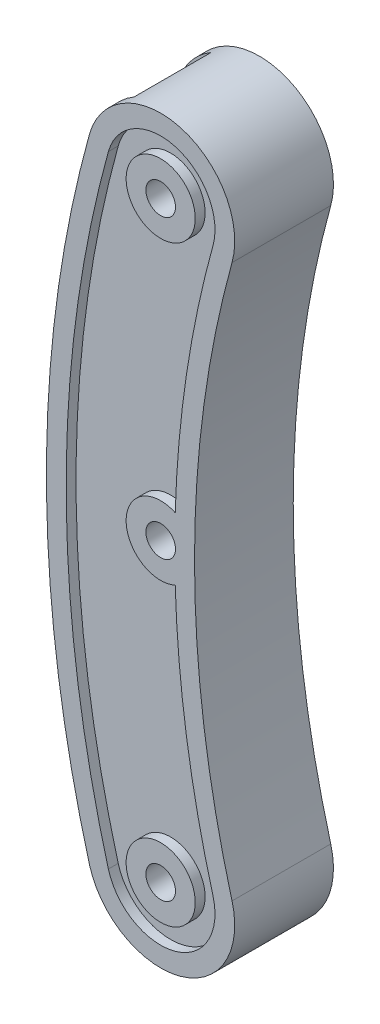
ISO-10303-21;
HEADER;
FILE_DESCRIPTION(('STEP AP214'),'2;1');
FILE_NAME('part.step','',(''),(''),'','','');
FILE_SCHEMA(('AUTOMOTIVE_DESIGN { 1 0 10303 214 1 1 1 1 }'));
ENDSEC;
DATA;
#1=APPLICATION_CONTEXT('core data for automotive mechanical design processes');
#2=APPLICATION_PROTOCOL_DEFINITION('international standard','automotive_design',2000,#1);
#3=PRODUCT_CONTEXT('',#1,'mechanical');
#4=PRODUCT('Part','Part','',(#3));
#5=PRODUCT_RELATED_PRODUCT_CATEGORY('part','',(#4));
#6=PRODUCT_DEFINITION_FORMATION('','',#4);
#7=PRODUCT_DEFINITION_CONTEXT('part definition',#1,'design');
#8=PRODUCT_DEFINITION('design','',#6,#7);
#9=PRODUCT_DEFINITION_SHAPE('','',#8);
#10=(LENGTH_UNIT() NAMED_UNIT(*) SI_UNIT(.MILLI.,.METRE.));
#11=(NAMED_UNIT(*) PLANE_ANGLE_UNIT() SI_UNIT($,.RADIAN.));
#12=(NAMED_UNIT(*) SI_UNIT($,.STERADIAN.) SOLID_ANGLE_UNIT());
#13=UNCERTAINTY_MEASURE_WITH_UNIT(LENGTH_MEASURE(1.E-05),#10,'distance_accuracy_value','');
#14=(GEOMETRIC_REPRESENTATION_CONTEXT(3) GLOBAL_UNCERTAINTY_ASSIGNED_CONTEXT((#13)) GLOBAL_UNIT_ASSIGNED_CONTEXT((#10,
#11,#12)) REPRESENTATION_CONTEXT('',''));
#15=CARTESIAN_POINT('',(0.,0.,0.));
#16=DIRECTION('',(0.,0.,1.));
#17=DIRECTION('',(1.,0.,0.));
#18=AXIS2_PLACEMENT_3D('',#15,#16,#17);
#19=CARTESIAN_POINT('',(0.,0.,5.));
#20=DIRECTION('',(0.,0.,-1.));
#21=DIRECTION('',(-1.,0.,0.));
#22=AXIS2_PLACEMENT_3D('',#19,#20,#21);
#23=CYLINDRICAL_SURFACE('',#22,120.);
#24=CARTESIAN_POINT('',(0.,0.,-3.9));
#25=DIRECTION('',(0.,0.,1.));
#26=DIRECTION('',(1.,0.,0.));
#27=AXIS2_PLACEMENT_3D('',#24,#25,#26);
#28=CIRCLE('',#27,120.);
#29=CARTESIAN_POINT('',(-115.654658358408,32.,-3.9));
#30=VERTEX_POINT('',#29);
#31=CARTESIAN_POINT('',(-115.654658358408,-32.,-3.9));
#32=VERTEX_POINT('',#31);
#33=EDGE_CURVE('E312',#30,#32,#28,.T.);
#34=ORIENTED_EDGE('',*,*,#33,.F.);
#35=DIRECTION('',(0.,0.,-1.));
#36=VECTOR('',#35,1.);
#37=CARTESIAN_POINT('',(-115.654658358408,32.,5.));
#38=LINE('',#37,#36);
#39=CARTESIAN_POINT('',(-115.654658358408,32.,-5.));
#40=VERTEX_POINT('',#39);
#41=EDGE_CURVE('E178',#30,#40,#38,.T.);
#42=ORIENTED_EDGE('',*,*,#41,.T.);
#43=CARTESIAN_POINT('',(0.,0.,-5.));
#44=DIRECTION('',(0.,0.,1.));
#45=DIRECTION('',(1.,0.,0.));
#46=AXIS2_PLACEMENT_3D('',#43,#44,#45);
#47=CIRCLE('',#46,120.);
#48=CARTESIAN_POINT('',(-115.654658358408,-32.,-5.));
#49=VERTEX_POINT('',#48);
#50=EDGE_CURVE('E192',#40,#49,#47,.T.);
#51=ORIENTED_EDGE('',*,*,#50,.T.);
#52=DIRECTION('',(0.,0.,-1.));
#53=VECTOR('',#52,1.);
#54=CARTESIAN_POINT('',(-115.654658358408,-32.,5.));
#55=LINE('',#54,#53);
#56=EDGE_CURVE('E168',#32,#49,#55,.T.);
#57=ORIENTED_EDGE('',*,*,#56,.F.);
#58=EDGE_LOOP('',(#34,#42,#51,#57));
#59=FACE_BOUND('',#58,.T.);
#60=ADVANCED_FACE('F40',(#59),#23,.T.);
#61=CARTESIAN_POINT('',(-108.426242211007,-30.,5.));
#62=DIRECTION('',(0.,0.,-1.));
#63=DIRECTION('',(-1.,0.,0.));
#64=AXIS2_PLACEMENT_3D('',#61,#62,#63);
#65=CYLINDRICAL_SURFACE('',#64,7.50000000000001);
#66=CARTESIAN_POINT('',(-108.426242211007,-30.,-3.9));
#67=DIRECTION('',(0.,0.,1.));
#68=DIRECTION('',(1.,0.,0.));
#69=AXIS2_PLACEMENT_3D('',#66,#67,#68);
#70=CIRCLE('',#69,7.50000000000001);
#71=CARTESIAN_POINT('',(-112.223470557122,-36.4676933204556,-3.9));
#72=VERTEX_POINT('',#71);
#73=EDGE_CURVE('E309',#32,#72,#70,.T.);
#74=ORIENTED_EDGE('',*,*,#73,.F.);
#75=ORIENTED_EDGE('',*,*,#56,.T.);
#76=CARTESIAN_POINT('',(-108.426242211007,-30.,-5.));
#77=DIRECTION('',(0.,0.,1.));
#78=DIRECTION('',(1.,0.,0.));
#79=AXIS2_PLACEMENT_3D('',#76,#77,#78);
#80=CIRCLE('',#79,7.50000000000001);
#81=CARTESIAN_POINT('',(-101.197826063607,-28.,-5.));
#82=VERTEX_POINT('',#81);
#83=EDGE_CURVE('E188',#49,#82,#80,.T.);
#84=ORIENTED_EDGE('',*,*,#83,.T.);
#85=DIRECTION('',(0.,0.,-1.));
#86=VECTOR('',#85,1.);
#87=CARTESIAN_POINT('',(-101.197826063607,-28.,5.));
#88=LINE('',#87,#86);
#89=CARTESIAN_POINT('',(-101.197826063607,-28.,5.));
#90=VERTEX_POINT('',#89);
#91=EDGE_CURVE('E169',#90,#82,#88,.T.);
#92=ORIENTED_EDGE('',*,*,#91,.F.);
#93=CARTESIAN_POINT('',(-108.426242211007,-30.,5.));
#94=DIRECTION('',(0.,0.,1.));
#95=DIRECTION('',(1.,0.,0.));
#96=AXIS2_PLACEMENT_3D('',#93,#94,#95);
#97=CIRCLE('',#96,7.50000000000001);
#98=CARTESIAN_POINT('',(-115.654658358408,-32.,5.));
#99=VERTEX_POINT('',#98);
#100=EDGE_CURVE('E217',#99,#90,#97,.T.);
#101=ORIENTED_EDGE('',*,*,#100,.F.);
#102=CARTESIAN_POINT('',(-115.654658358408,-32.,3.9));
#103=VERTEX_POINT('',#102);
#104=EDGE_CURVE('E150',#99,#103,#55,.T.);
#105=ORIENTED_EDGE('',*,*,#104,.T.);
#106=CARTESIAN_POINT('',(-108.426242211007,-30.,3.9));
#107=DIRECTION('',(0.,0.,1.));
#108=DIRECTION('',(1.,0.,0.));
#109=AXIS2_PLACEMENT_3D('',#106,#107,#108);
#110=CIRCLE('',#109,7.50000000000001);
#111=CARTESIAN_POINT('',(-112.223470557122,-36.4676933204556,3.9));
#112=VERTEX_POINT('',#111);
#113=EDGE_CURVE('E315',#103,#112,#110,.T.);
#114=ORIENTED_EDGE('',*,*,#113,.T.);
#115=DIRECTION('',(0.,0.,1.));
#116=VECTOR('',#115,1.);
#117=CARTESIAN_POINT('',(-112.223470557122,-36.4676933204553,0.));
#118=LINE('',#117,#116);
#119=EDGE_CURVE('E157',#72,#112,#118,.T.);
#120=ORIENTED_EDGE('',*,*,#119,.F.);
#121=EDGE_LOOP('',(#74,#75,#84,#92,#101,#105,#114,#120));
#122=FACE_BOUND('',#121,.T.);
#123=ADVANCED_FACE('F324',(#122),#65,.T.);
#124=CARTESIAN_POINT('',(-108.426242211007,30.,5.));
#125=DIRECTION('',(0.,0.,-1.));
#126=DIRECTION('',(-1.,0.,0.));
#127=AXIS2_PLACEMENT_3D('',#124,#125,#126);
#128=CYLINDRICAL_SURFACE('',#127,7.50000000000001);
#129=ORIENTED_EDGE('',*,*,#41,.F.);
#130=CARTESIAN_POINT('',(-108.426242211007,30.,-3.9));
#131=DIRECTION('',(0.,0.,1.));
#132=DIRECTION('',(1.,0.,0.));
#133=AXIS2_PLACEMENT_3D('',#130,#131,#132);
#134=CIRCLE('',#133,7.50000000000001);
#135=CARTESIAN_POINT('',(-112.223470557122,36.4676933204556,-3.9));
#136=VERTEX_POINT('',#135);
#137=EDGE_CURVE('E11',#30,#136,#134,.F.);
#138=ORIENTED_EDGE('',*,*,#137,.T.);
#139=DIRECTION('',(0.,0.,1.));
#140=VECTOR('',#139,1.);
#141=CARTESIAN_POINT('',(-112.223470557122,36.4676933204553,0.));
#142=LINE('',#141,#140);
#143=CARTESIAN_POINT('',(-112.223470557122,36.4676933204556,3.9));
#144=VERTEX_POINT('',#143);
#145=EDGE_CURVE('E49',#136,#144,#142,.T.);
#146=ORIENTED_EDGE('',*,*,#145,.T.);
#147=CARTESIAN_POINT('',(-108.426242211007,30.,3.9));
#148=DIRECTION('',(0.,0.,1.));
#149=DIRECTION('',(1.,0.,0.));
#150=AXIS2_PLACEMENT_3D('',#147,#148,#149);
#151=CIRCLE('',#150,7.50000000000001);
#152=CARTESIAN_POINT('',(-115.654658358408,32.,3.9));
#153=VERTEX_POINT('',#152);
#154=EDGE_CURVE('E141',#153,#144,#151,.F.);
#155=ORIENTED_EDGE('',*,*,#154,.F.);
#156=CARTESIAN_POINT('',(-115.654658358408,32.,5.));
#157=VERTEX_POINT('',#156);
#158=EDGE_CURVE('E175',#157,#153,#38,.T.);
#159=ORIENTED_EDGE('',*,*,#158,.F.);
#160=CARTESIAN_POINT('',(-108.426242211007,30.,5.));
#161=DIRECTION('',(0.,0.,1.));
#162=DIRECTION('',(1.,0.,0.));
#163=AXIS2_PLACEMENT_3D('',#160,#161,#162);
#164=CIRCLE('',#163,7.50000000000001);
#165=CARTESIAN_POINT('',(-101.197826063607,28.,5.));
#166=VERTEX_POINT('',#165);
#167=EDGE_CURVE('E209',#157,#166,#164,.F.);
#168=ORIENTED_EDGE('',*,*,#167,.T.);
#169=DIRECTION('',(0.,0.,-1.));
#170=VECTOR('',#169,1.);
#171=CARTESIAN_POINT('',(-101.197826063607,28.,5.));
#172=LINE('',#171,#170);
#173=CARTESIAN_POINT('',(-101.197826063607,28.,-5.));
#174=VERTEX_POINT('',#173);
#175=EDGE_CURVE('E172',#166,#174,#172,.T.);
#176=ORIENTED_EDGE('',*,*,#175,.T.);
#177=CARTESIAN_POINT('',(-108.426242211007,30.,-5.));
#178=DIRECTION('',(0.,0.,1.));
#179=DIRECTION('',(1.,0.,0.));
#180=AXIS2_PLACEMENT_3D('',#177,#178,#179);
#181=CIRCLE('',#180,7.50000000000001);
#182=EDGE_CURVE('E179',#40,#174,#181,.F.);
#183=ORIENTED_EDGE('',*,*,#182,.F.);
#184=EDGE_LOOP('',(#129,#138,#146,#155,#159,#168,#176,#183));
#185=FACE_BOUND('',#184,.T.);
#186=ADVANCED_FACE('F162',(#185),#128,.T.);
#187=CARTESIAN_POINT('',(0.,0.,5.));
#188=DIRECTION('',(0.,0.,1.));
#189=DIRECTION('',(1.,0.,0.));
#190=AXIS2_PLACEMENT_3D('',#187,#188,#189);
#191=PLANE('',#190);
#192=CARTESIAN_POINT('',(-108.426242211007,-30.,5.));
#193=DIRECTION('',(0.,0.,1.));
#194=DIRECTION('',(1.,0.,0.));
#195=AXIS2_PLACEMENT_3D('',#192,#193,#194);
#196=CIRCLE('',#195,1.5);
#197=CARTESIAN_POINT('',(-106.926242211007,-30.,5.));
#198=VERTEX_POINT('',#197);
#199=EDGE_CURVE('E224',#198,#198,#196,.T.);
#200=ORIENTED_EDGE('',*,*,#199,.F.);
#201=EDGE_LOOP('',(#200));
#202=FACE_BOUND('',#201,.T.);
#203=CARTESIAN_POINT('',(-108.426242211007,-30.,5.));
#204=DIRECTION('',(0.,0.,1.));
#205=DIRECTION('',(1.,0.,0.));
#206=AXIS2_PLACEMENT_3D('',#203,#204,#205);
#207=CIRCLE('',#206,3.50000000000001);
#208=CARTESIAN_POINT('',(-104.926242211007,-30.,5.));
#209=VERTEX_POINT('',#208);
#210=EDGE_CURVE('E273',#209,#209,#207,.T.);
#211=ORIENTED_EDGE('',*,*,#210,.T.);
#212=EDGE_LOOP('',(#211));
#213=FACE_BOUND('',#212,.T.);
#214=ADVANCED_FACE('F403',(#202,#213),#191,.T.);
#215=CARTESIAN_POINT('',(-108.426242211007,30.,5.));
#216=DIRECTION('',(0.,0.,1.));
#217=DIRECTION('',(1.,0.,0.));
#218=AXIS2_PLACEMENT_3D('',#215,#216,#217);
#219=CIRCLE('',#218,1.5);
#220=CARTESIAN_POINT('',(-106.926242211007,30.,5.));
#221=VERTEX_POINT('',#220);
#222=EDGE_CURVE('E183',#221,#221,#219,.T.);
#223=ORIENTED_EDGE('',*,*,#222,.F.);
#224=EDGE_LOOP('',(#223));
#225=FACE_BOUND('',#224,.T.);
#226=CARTESIAN_POINT('',(-108.426242211007,30.,5.));
#227=DIRECTION('',(0.,0.,1.));
#228=DIRECTION('',(1.,0.,0.));
#229=AXIS2_PLACEMENT_3D('',#226,#227,#228);
#230=CIRCLE('',#229,3.50000000000001);
#231=CARTESIAN_POINT('',(-104.926242211007,30.,5.));
#232=VERTEX_POINT('',#231);
#233=EDGE_CURVE('E277',#232,#232,#230,.T.);
#234=ORIENTED_EDGE('',*,*,#233,.T.);
#235=EDGE_LOOP('',(#234));
#236=FACE_BOUND('',#235,.T.);
#237=ADVANCED_FACE('F401',(#225,#236),#191,.T.);
#238=CARTESIAN_POINT('',(0.,0.,5.));
#239=DIRECTION('',(0.,0.,1.));
#240=DIRECTION('',(1.,0.,0.));
#241=AXIS2_PLACEMENT_3D('',#238,#239,#240);
#242=CIRCLE('',#241,120.);
#243=EDGE_CURVE('E220',#157,#99,#242,.T.);
#244=ORIENTED_EDGE('',*,*,#243,.T.);
#245=ORIENTED_EDGE('',*,*,#100,.T.);
#246=CARTESIAN_POINT('',(0.,0.,5.));
#247=DIRECTION('',(0.,0.,1.));
#248=DIRECTION('',(1.,0.,0.));
#249=AXIS2_PLACEMENT_3D('',#246,#247,#248);
#250=CIRCLE('',#249,105.);
#251=EDGE_CURVE('E213',#166,#90,#250,.T.);
#252=ORIENTED_EDGE('',*,*,#251,.F.);
#253=ORIENTED_EDGE('',*,*,#167,.F.);
#254=EDGE_LOOP('',(#244,#245,#252,#253));
#255=FACE_BOUND('',#254,.T.);
#256=CARTESIAN_POINT('',(-108.426242211007,0.,5.));
#257=DIRECTION('',(0.,0.,1.));
#258=DIRECTION('',(1.,0.,0.));
#259=AXIS2_PLACEMENT_3D('',#256,#257,#258);
#260=CIRCLE('',#259,1.5);
#261=CARTESIAN_POINT('',(-106.926242211007,0.,5.));
#262=VERTEX_POINT('',#261);
#263=EDGE_CURVE('E228',#262,#262,#260,.T.);
#264=ORIENTED_EDGE('',*,*,#263,.F.);
#265=EDGE_LOOP('',(#264));
#266=FACE_BOUND('',#265,.T.);
#267=CARTESIAN_POINT('',(-108.426242211007,30.,5.));
#268=DIRECTION('',(0.,0.,1.));
#269=DIRECTION('',(1.,0.,0.));
#270=AXIS2_PLACEMENT_3D('',#267,#268,#269);
#271=CIRCLE('',#270,5.50000000000002);
#272=CARTESIAN_POINT('',(-103.125403702913,28.5333333333333,5.));
#273=VERTEX_POINT('',#272);
#274=CARTESIAN_POINT('',(-113.727080719101,31.4666666666667,5.));
#275=VERTEX_POINT('',#274);
#276=EDGE_CURVE('E267',#273,#275,#271,.T.);
#277=ORIENTED_EDGE('',*,*,#276,.F.);
#278=CARTESIAN_POINT('',(0.,0.,5.));
#279=DIRECTION('',(0.,0.,1.));
#280=DIRECTION('',(1.,0.,0.));
#281=AXIS2_PLACEMENT_3D('',#278,#279,#280);
#282=CIRCLE('',#281,107.);
#283=CARTESIAN_POINT('',(-106.952890402972,3.17478100815802,5.));
#284=VERTEX_POINT('',#283);
#285=EDGE_CURVE('E64',#273,#284,#282,.T.);
#286=ORIENTED_EDGE('',*,*,#285,.T.);
#287=CARTESIAN_POINT('',(-108.426242211007,0.,5.));
#288=DIRECTION('',(0.,0.,1.));
#289=DIRECTION('',(1.,0.,0.));
#290=AXIS2_PLACEMENT_3D('',#287,#288,#289);
#291=CIRCLE('',#290,3.50000000000001);
#292=CARTESIAN_POINT('',(-106.952890402972,-3.17478100815802,5.));
#293=VERTEX_POINT('',#292);
#294=EDGE_CURVE('E253',#284,#293,#291,.T.);
#295=ORIENTED_EDGE('',*,*,#294,.T.);
#296=CARTESIAN_POINT('',(-103.125403702914,-28.5333333333333,5.));
#297=VERTEX_POINT('',#296);
#298=EDGE_CURVE('E258',#293,#297,#282,.T.);
#299=ORIENTED_EDGE('',*,*,#298,.T.);
#300=CARTESIAN_POINT('',(-108.426242211007,-30.,5.));
#301=DIRECTION('',(0.,0.,1.));
#302=DIRECTION('',(1.,0.,0.));
#303=AXIS2_PLACEMENT_3D('',#300,#301,#302);
#304=CIRCLE('',#303,5.50000000000001);
#305=CARTESIAN_POINT('',(-113.727080719101,-31.4666666666667,5.));
#306=VERTEX_POINT('',#305);
#307=EDGE_CURVE('E259',#306,#297,#304,.T.);
#308=ORIENTED_EDGE('',*,*,#307,.F.);
#309=CARTESIAN_POINT('',(0.,0.,5.));
#310=DIRECTION('',(0.,0.,1.));
#311=DIRECTION('',(1.,0.,0.));
#312=AXIS2_PLACEMENT_3D('',#309,#310,#311);
#313=CIRCLE('',#312,118.);
#314=EDGE_CURVE('E263',#275,#306,#313,.T.);
#315=ORIENTED_EDGE('',*,*,#314,.F.);
#316=EDGE_LOOP('',(#277,#286,#295,#299,#308,#315));
#317=FACE_BOUND('',#316,.T.);
#318=ADVANCED_FACE('F335',(#255,#266,#317),#191,.T.);
#319=ORIENTED_EDGE('',*,*,#158,.T.);
#320=CARTESIAN_POINT('',(0.,0.,3.9));
#321=DIRECTION('',(0.,0.,1.));
#322=DIRECTION('',(1.,0.,0.));
#323=AXIS2_PLACEMENT_3D('',#320,#321,#322);
#324=CIRCLE('',#323,120.);
#325=EDGE_CURVE('E56',#153,#103,#324,.T.);
#326=ORIENTED_EDGE('',*,*,#325,.T.);
#327=ORIENTED_EDGE('',*,*,#104,.F.);
#328=ORIENTED_EDGE('',*,*,#243,.F.);
#329=EDGE_LOOP('',(#319,#326,#327,#328));
#330=FACE_BOUND('',#329,.T.);
#331=ADVANCED_FACE('F328',(#330),#23,.T.);
#332=CARTESIAN_POINT('',(0.,0.,5.));
#333=DIRECTION('',(0.,0.,-1.));
#334=DIRECTION('',(-1.,0.,0.));
#335=AXIS2_PLACEMENT_3D('',#332,#333,#334);
#336=CYLINDRICAL_SURFACE('',#335,105.);
#337=CARTESIAN_POINT('',(0.,0.,-5.));
#338=DIRECTION('',(0.,0.,1.));
#339=DIRECTION('',(1.,0.,0.));
#340=AXIS2_PLACEMENT_3D('',#337,#338,#339);
#341=CIRCLE('',#340,105.);
#342=EDGE_CURVE('E184',#174,#82,#341,.T.);
#343=ORIENTED_EDGE('',*,*,#342,.F.);
#344=ORIENTED_EDGE('',*,*,#175,.F.);
#345=ORIENTED_EDGE('',*,*,#251,.T.);
#346=ORIENTED_EDGE('',*,*,#91,.T.);
#347=EDGE_LOOP('',(#343,#344,#345,#346));
#348=FACE_BOUND('',#347,.T.);
#349=ADVANCED_FACE('F339',(#348),#336,.F.);
#350=CARTESIAN_POINT('',(-108.426242211007,-30.,5.));
#351=DIRECTION('',(0.,0.,-1.));
#352=DIRECTION('',(-1.,0.,0.));
#353=AXIS2_PLACEMENT_3D('',#350,#351,#352);
#354=CYLINDRICAL_SURFACE('',#353,1.5);
#355=ORIENTED_EDGE('',*,*,#199,.T.);
#356=EDGE_LOOP('',(#355));
#357=FACE_BOUND('',#356,.T.);
#358=CARTESIAN_POINT('',(-108.426242211007,-30.,-5.));
#359=DIRECTION('',(0.,0.,1.));
#360=DIRECTION('',(1.,0.,0.));
#361=AXIS2_PLACEMENT_3D('',#358,#359,#360);
#362=CIRCLE('',#361,1.5);
#363=CARTESIAN_POINT('',(-106.926242211007,-30.,-5.));
#364=VERTEX_POINT('',#363);
#365=EDGE_CURVE('E196',#364,#364,#362,.T.);
#366=ORIENTED_EDGE('',*,*,#365,.F.);
#367=EDGE_LOOP('',(#366));
#368=FACE_BOUND('',#367,.T.);
#369=ADVANCED_FACE('F398',(#357,#368),#354,.F.);
#370=CARTESIAN_POINT('',(-108.426242211007,0.,5.));
#371=DIRECTION('',(0.,0.,-1.));
#372=DIRECTION('',(-1.,0.,0.));
#373=AXIS2_PLACEMENT_3D('',#370,#371,#372);
#374=CYLINDRICAL_SURFACE('',#373,1.5);
#375=ORIENTED_EDGE('',*,*,#263,.T.);
#376=EDGE_LOOP('',(#375));
#377=FACE_BOUND('',#376,.T.);
#378=CARTESIAN_POINT('',(-108.426242211007,0.,-5.));
#379=DIRECTION('',(0.,0.,1.));
#380=DIRECTION('',(1.,0.,0.));
#381=AXIS2_PLACEMENT_3D('',#378,#379,#380);
#382=CIRCLE('',#381,1.5);
#383=CARTESIAN_POINT('',(-106.926242211007,0.,-5.));
#384=VERTEX_POINT('',#383);
#385=EDGE_CURVE('E200',#384,#384,#382,.T.);
#386=ORIENTED_EDGE('',*,*,#385,.F.);
#387=EDGE_LOOP('',(#386));
#388=FACE_BOUND('',#387,.T.);
#389=ADVANCED_FACE('F560',(#377,#388),#374,.F.);
#390=CARTESIAN_POINT('',(-108.426242211007,30.,5.));
#391=DIRECTION('',(0.,0.,-1.));
#392=DIRECTION('',(-1.,0.,0.));
#393=AXIS2_PLACEMENT_3D('',#390,#391,#392);
#394=CYLINDRICAL_SURFACE('',#393,1.5);
#395=ORIENTED_EDGE('',*,*,#222,.T.);
#396=EDGE_LOOP('',(#395));
#397=FACE_BOUND('',#396,.T.);
#398=CARTESIAN_POINT('',(-108.426242211007,30.,-5.));
#399=DIRECTION('',(0.,0.,1.));
#400=DIRECTION('',(1.,0.,0.));
#401=AXIS2_PLACEMENT_3D('',#398,#399,#400);
#402=CIRCLE('',#401,1.5);
#403=CARTESIAN_POINT('',(-106.926242211007,30.,-5.));
#404=VERTEX_POINT('',#403);
#405=EDGE_CURVE('E204',#404,#404,#402,.T.);
#406=ORIENTED_EDGE('',*,*,#405,.F.);
#407=EDGE_LOOP('',(#406));
#408=FACE_BOUND('',#407,.T.);
#409=ADVANCED_FACE('F42',(#397,#408),#394,.F.);
#410=CARTESIAN_POINT('',(0.,0.,-5.));
#411=DIRECTION('',(0.,0.,1.));
#412=DIRECTION('',(1.,0.,0.));
#413=AXIS2_PLACEMENT_3D('',#410,#411,#412);
#414=PLANE('',#413);
#415=ORIENTED_EDGE('',*,*,#405,.T.);
#416=EDGE_LOOP('',(#415));
#417=FACE_BOUND('',#416,.T.);
#418=ORIENTED_EDGE('',*,*,#385,.T.);
#419=EDGE_LOOP('',(#418));
#420=FACE_BOUND('',#419,.T.);
#421=ORIENTED_EDGE('',*,*,#365,.T.);
#422=EDGE_LOOP('',(#421));
#423=FACE_BOUND('',#422,.T.);
#424=ORIENTED_EDGE('',*,*,#50,.F.);
#425=ORIENTED_EDGE('',*,*,#182,.T.);
#426=ORIENTED_EDGE('',*,*,#342,.T.);
#427=ORIENTED_EDGE('',*,*,#83,.F.);
#428=EDGE_LOOP('',(#424,#425,#426,#427));
#429=FACE_BOUND('',#428,.T.);
#430=ADVANCED_FACE('F343',(#417,#420,#423,#429),#414,.F.);
#431=CARTESIAN_POINT('',(0.,0.,4.));
#432=DIRECTION('',(0.,0.,1.));
#433=DIRECTION('',(1.,0.,0.));
#434=AXIS2_PLACEMENT_3D('',#431,#432,#433);
#435=CYLINDRICAL_SURFACE('',#434,107.);
#436=ORIENTED_EDGE('',*,*,#285,.F.);
#437=DIRECTION('',(0.,0.,1.));
#438=VECTOR('',#437,1.);
#439=CARTESIAN_POINT('',(-103.125403702914,28.5333333333333,4.));
#440=LINE('',#439,#438);
#441=CARTESIAN_POINT('',(-103.125403702914,28.5333333333333,4.));
#442=VERTEX_POINT('',#441);
#443=EDGE_CURVE('E235',#442,#273,#440,.T.);
#444=ORIENTED_EDGE('',*,*,#443,.F.);
#445=CARTESIAN_POINT('',(0.,0.,4.));
#446=DIRECTION('',(0.,0.,1.));
#447=DIRECTION('',(1.,0.,0.));
#448=AXIS2_PLACEMENT_3D('',#445,#446,#447);
#449=CIRCLE('',#448,107.);
#450=CARTESIAN_POINT('',(-106.952890402972,3.17478100815802,4.));
#451=VERTEX_POINT('',#450);
#452=EDGE_CURVE('E296',#442,#451,#449,.T.);
#453=ORIENTED_EDGE('',*,*,#452,.T.);
#454=DIRECTION('',(0.,0.,1.));
#455=VECTOR('',#454,1.);
#456=CARTESIAN_POINT('',(-106.952890402972,3.17478100815802,4.));
#457=LINE('',#456,#455);
#458=EDGE_CURVE('E208',#451,#284,#457,.T.);
#459=ORIENTED_EDGE('',*,*,#458,.T.);
#460=EDGE_LOOP('',(#436,#444,#453,#459));
#461=FACE_BOUND('',#460,.T.);
#462=ADVANCED_FACE('F370',(#461),#435,.T.);
#463=CARTESIAN_POINT('',(-108.426242211007,0.,4.));
#464=DIRECTION('',(0.,0.,1.));
#465=DIRECTION('',(1.,0.,0.));
#466=AXIS2_PLACEMENT_3D('',#463,#464,#465);
#467=CYLINDRICAL_SURFACE('',#466,3.50000000000001);
#468=ORIENTED_EDGE('',*,*,#294,.F.);
#469=ORIENTED_EDGE('',*,*,#458,.F.);
#470=CARTESIAN_POINT('',(-108.426242211007,0.,4.));
#471=DIRECTION('',(0.,0.,1.));
#472=DIRECTION('',(1.,0.,0.));
#473=AXIS2_PLACEMENT_3D('',#470,#471,#472);
#474=CIRCLE('',#473,3.50000000000001);
#475=CARTESIAN_POINT('',(-106.952890402972,-3.17478100815802,4.));
#476=VERTEX_POINT('',#475);
#477=EDGE_CURVE('E239',#451,#476,#474,.T.);
#478=ORIENTED_EDGE('',*,*,#477,.T.);
#479=DIRECTION('',(0.,0.,1.));
#480=VECTOR('',#479,1.);
#481=CARTESIAN_POINT('',(-106.952890402972,-3.17478100815802,4.));
#482=LINE('',#481,#480);
#483=EDGE_CURVE('E248',#476,#293,#482,.T.);
#484=ORIENTED_EDGE('',*,*,#483,.T.);
#485=EDGE_LOOP('',(#468,#469,#478,#484));
#486=FACE_BOUND('',#485,.T.);
#487=ADVANCED_FACE('F375',(#486),#467,.T.);
#488=ORIENTED_EDGE('',*,*,#298,.F.);
#489=ORIENTED_EDGE('',*,*,#483,.F.);
#490=CARTESIAN_POINT('',(-103.125403702914,-28.5333333333333,4.));
#491=VERTEX_POINT('',#490);
#492=EDGE_CURVE('E283',#476,#491,#449,.T.);
#493=ORIENTED_EDGE('',*,*,#492,.T.);
#494=DIRECTION('',(0.,0.,1.));
#495=VECTOR('',#494,1.);
#496=CARTESIAN_POINT('',(-103.125403702914,-28.5333333333333,4.));
#497=LINE('',#496,#495);
#498=EDGE_CURVE('E245',#491,#297,#497,.T.);
#499=ORIENTED_EDGE('',*,*,#498,.T.);
#500=EDGE_LOOP('',(#488,#489,#493,#499));
#501=FACE_BOUND('',#500,.T.);
#502=ADVANCED_FACE('F357',(#501),#435,.T.);
#503=CARTESIAN_POINT('',(-108.426242211007,-30.,4.));
#504=DIRECTION('',(0.,0.,1.));
#505=DIRECTION('',(1.,0.,0.));
#506=AXIS2_PLACEMENT_3D('',#503,#504,#505);
#507=CYLINDRICAL_SURFACE('',#506,5.50000000000001);
#508=ORIENTED_EDGE('',*,*,#307,.T.);
#509=ORIENTED_EDGE('',*,*,#498,.F.);
#510=CARTESIAN_POINT('',(-108.426242211007,-30.,4.));
#511=DIRECTION('',(0.,0.,1.));
#512=DIRECTION('',(1.,0.,0.));
#513=AXIS2_PLACEMENT_3D('',#510,#511,#512);
#514=CIRCLE('',#513,5.50000000000001);
#515=CARTESIAN_POINT('',(-113.727080719101,-31.4666666666667,4.));
#516=VERTEX_POINT('',#515);
#517=EDGE_CURVE('E284',#516,#491,#514,.T.);
#518=ORIENTED_EDGE('',*,*,#517,.F.);
#519=DIRECTION('',(0.,0.,1.));
#520=VECTOR('',#519,1.);
#521=CARTESIAN_POINT('',(-113.727080719101,-31.4666666666667,4.));
#522=LINE('',#521,#520);
#523=EDGE_CURVE('E242',#516,#306,#522,.T.);
#524=ORIENTED_EDGE('',*,*,#523,.T.);
#525=EDGE_LOOP('',(#508,#509,#518,#524));
#526=FACE_BOUND('',#525,.T.);
#527=ADVANCED_FACE('F362',(#526),#507,.F.);
#528=CARTESIAN_POINT('',(0.,0.,4.));
#529=DIRECTION('',(0.,0.,1.));
#530=DIRECTION('',(1.,0.,0.));
#531=AXIS2_PLACEMENT_3D('',#528,#529,#530);
#532=CYLINDRICAL_SURFACE('',#531,118.);
#533=ORIENTED_EDGE('',*,*,#314,.T.);
#534=ORIENTED_EDGE('',*,*,#523,.F.);
#535=CARTESIAN_POINT('',(0.,0.,4.));
#536=DIRECTION('',(0.,0.,1.));
#537=DIRECTION('',(1.,0.,0.));
#538=AXIS2_PLACEMENT_3D('',#535,#536,#537);
#539=CIRCLE('',#538,118.);
#540=CARTESIAN_POINT('',(-113.727080719101,31.4666666666667,4.));
#541=VERTEX_POINT('',#540);
#542=EDGE_CURVE('E288',#541,#516,#539,.T.);
#543=ORIENTED_EDGE('',*,*,#542,.F.);
#544=DIRECTION('',(0.,0.,1.));
#545=VECTOR('',#544,1.);
#546=CARTESIAN_POINT('',(-113.727080719101,31.4666666666667,4.));
#547=LINE('',#546,#545);
#548=EDGE_CURVE('E238',#541,#275,#547,.T.);
#549=ORIENTED_EDGE('',*,*,#548,.T.);
#550=EDGE_LOOP('',(#533,#534,#543,#549));
#551=FACE_BOUND('',#550,.T.);
#552=ADVANCED_FACE('F365',(#551),#532,.F.);
#553=CARTESIAN_POINT('',(-108.426242211007,-30.,4.));
#554=DIRECTION('',(0.,0.,1.));
#555=DIRECTION('',(1.,0.,0.));
#556=AXIS2_PLACEMENT_3D('',#553,#554,#555);
#557=CYLINDRICAL_SURFACE('',#556,3.50000000000001);
#558=CARTESIAN_POINT('',(-108.426242211007,-30.,4.));
#559=DIRECTION('',(0.,0.,1.));
#560=DIRECTION('',(1.,0.,0.));
#561=AXIS2_PLACEMENT_3D('',#558,#559,#560);
#562=CIRCLE('',#561,3.50000000000001);
#563=CARTESIAN_POINT('',(-104.926242211007,-30.,4.));
#564=VERTEX_POINT('',#563);
#565=EDGE_CURVE('E300',#564,#564,#562,.T.);
#566=ORIENTED_EDGE('',*,*,#565,.T.);
#567=EDGE_LOOP('',(#566));
#568=FACE_BOUND('',#567,.T.);
#569=ORIENTED_EDGE('',*,*,#210,.F.);
#570=EDGE_LOOP('',(#569));
#571=FACE_BOUND('',#570,.T.);
#572=ADVANCED_FACE('F419',(#568,#571),#557,.T.);
#573=CARTESIAN_POINT('',(-108.426242211007,30.,4.));
#574=DIRECTION('',(0.,0.,1.));
#575=DIRECTION('',(1.,0.,0.));
#576=AXIS2_PLACEMENT_3D('',#573,#574,#575);
#577=CYLINDRICAL_SURFACE('',#576,3.50000000000001);
#578=CARTESIAN_POINT('',(-108.426242211007,30.,4.));
#579=DIRECTION('',(0.,0.,1.));
#580=DIRECTION('',(1.,0.,0.));
#581=AXIS2_PLACEMENT_3D('',#578,#579,#580);
#582=CIRCLE('',#581,3.50000000000001);
#583=CARTESIAN_POINT('',(-104.926242211007,30.,4.));
#584=VERTEX_POINT('',#583);
#585=EDGE_CURVE('E257',#584,#584,#582,.T.);
#586=ORIENTED_EDGE('',*,*,#585,.T.);
#587=EDGE_LOOP('',(#586));
#588=FACE_BOUND('',#587,.T.);
#589=ORIENTED_EDGE('',*,*,#233,.F.);
#590=EDGE_LOOP('',(#589));
#591=FACE_BOUND('',#590,.T.);
#592=ADVANCED_FACE('F421',(#588,#591),#577,.T.);
#593=CARTESIAN_POINT('',(-108.426242211007,30.,4.));
#594=DIRECTION('',(0.,0.,1.));
#595=DIRECTION('',(1.,0.,0.));
#596=AXIS2_PLACEMENT_3D('',#593,#594,#595);
#597=CYLINDRICAL_SURFACE('',#596,5.50000000000002);
#598=ORIENTED_EDGE('',*,*,#276,.T.);
#599=ORIENTED_EDGE('',*,*,#548,.F.);
#600=CARTESIAN_POINT('',(-108.426242211007,30.,4.));
#601=DIRECTION('',(0.,0.,1.));
#602=DIRECTION('',(1.,0.,0.));
#603=AXIS2_PLACEMENT_3D('',#600,#601,#602);
#604=CIRCLE('',#603,5.50000000000002);
#605=EDGE_CURVE('E292',#442,#541,#604,.T.);
#606=ORIENTED_EDGE('',*,*,#605,.F.);
#607=ORIENTED_EDGE('',*,*,#443,.T.);
#608=EDGE_LOOP('',(#598,#599,#606,#607));
#609=FACE_BOUND('',#608,.T.);
#610=ADVANCED_FACE('F367',(#609),#597,.F.);
#611=CARTESIAN_POINT('',(0.,0.,4.));
#612=DIRECTION('',(0.,0.,1.));
#613=DIRECTION('',(1.,0.,0.));
#614=AXIS2_PLACEMENT_3D('',#611,#612,#613);
#615=PLANE('',#614);
#616=ORIENTED_EDGE('',*,*,#585,.F.);
#617=EDGE_LOOP('',(#616));
#618=FACE_BOUND('',#617,.T.);
#619=ORIENTED_EDGE('',*,*,#565,.F.);
#620=EDGE_LOOP('',(#619));
#621=FACE_BOUND('',#620,.T.);
#622=ORIENTED_EDGE('',*,*,#452,.F.);
#623=ORIENTED_EDGE('',*,*,#605,.T.);
#624=ORIENTED_EDGE('',*,*,#542,.T.);
#625=ORIENTED_EDGE('',*,*,#517,.T.);
#626=ORIENTED_EDGE('',*,*,#492,.F.);
#627=ORIENTED_EDGE('',*,*,#477,.F.);
#628=EDGE_LOOP('',(#622,#623,#624,#625,#626,#627));
#629=FACE_BOUND('',#628,.T.);
#630=ADVANCED_FACE('F373',(#618,#621,#629),#615,.T.);
#631=CARTESIAN_POINT('',(0.,0.,-3.9));
#632=DIRECTION('',(0.,0.,1.));
#633=DIRECTION('',(1.,0.,0.));
#634=AXIS2_PLACEMENT_3D('',#631,#632,#633);
#635=CYLINDRICAL_SURFACE('',#634,118.);
#636=ORIENTED_EDGE('',*,*,#119,.T.);
#637=CARTESIAN_POINT('',(0.,0.,3.9));
#638=DIRECTION('',(0.,0.,1.));
#639=DIRECTION('',(1.,0.,0.));
#640=AXIS2_PLACEMENT_3D('',#637,#638,#639);
#641=CIRCLE('',#640,118.);
#642=EDGE_CURVE('E144',#144,#112,#641,.T.);
#643=ORIENTED_EDGE('',*,*,#642,.F.);
#644=ORIENTED_EDGE('',*,*,#145,.F.);
#645=CARTESIAN_POINT('',(0.,0.,-3.9));
#646=DIRECTION('',(0.,0.,1.));
#647=DIRECTION('',(1.,0.,0.));
#648=AXIS2_PLACEMENT_3D('',#645,#646,#647);
#649=CIRCLE('',#648,118.);
#650=EDGE_CURVE('E159',#136,#72,#649,.T.);
#651=ORIENTED_EDGE('',*,*,#650,.T.);
#652=EDGE_LOOP('',(#636,#643,#644,#651));
#653=FACE_BOUND('',#652,.T.);
#654=ADVANCED_FACE('F153',(#653),#635,.T.);
#655=CARTESIAN_POINT('',(0.,0.,-3.9));
#656=DIRECTION('',(0.,0.,1.));
#657=DIRECTION('',(1.,0.,0.));
#658=AXIS2_PLACEMENT_3D('',#655,#656,#657);
#659=PLANE('',#658);
#660=ORIENTED_EDGE('',*,*,#73,.T.);
#661=ORIENTED_EDGE('',*,*,#650,.F.);
#662=ORIENTED_EDGE('',*,*,#137,.F.);
#663=ORIENTED_EDGE('',*,*,#33,.T.);
#664=EDGE_LOOP('',(#660,#661,#662,#663));
#665=FACE_BOUND('',#664,.T.);
#666=ADVANCED_FACE('F487',(#665),#659,.T.);
#667=CARTESIAN_POINT('',(0.,0.,3.9));
#668=DIRECTION('',(0.,0.,1.));
#669=DIRECTION('',(1.,0.,0.));
#670=AXIS2_PLACEMENT_3D('',#667,#668,#669);
#671=PLANE('',#670);
#672=ORIENTED_EDGE('',*,*,#325,.F.);
#673=ORIENTED_EDGE('',*,*,#154,.T.);
#674=ORIENTED_EDGE('',*,*,#642,.T.);
#675=ORIENTED_EDGE('',*,*,#113,.F.);
#676=EDGE_LOOP('',(#672,#673,#674,#675));
#677=FACE_BOUND('',#676,.T.);
#678=ADVANCED_FACE('F143',(#677),#671,.F.);
#679=CLOSED_SHELL('',(#60,#123,#186,#214,#237,#318,#331,#349,#369,#389,#409,#430,#462,#487,#502,
#527,#552,#572,#592,#610,#630,#654,#666,#678));
#680=MANIFOLD_SOLID_BREP('B2',#679);
#681=ADVANCED_BREP_SHAPE_REPRESENTATION('',(#18,#680),#14);
#682=SHAPE_DEFINITION_REPRESENTATION(#9,#681);
ENDSEC;
END-ISO-10303-21;
